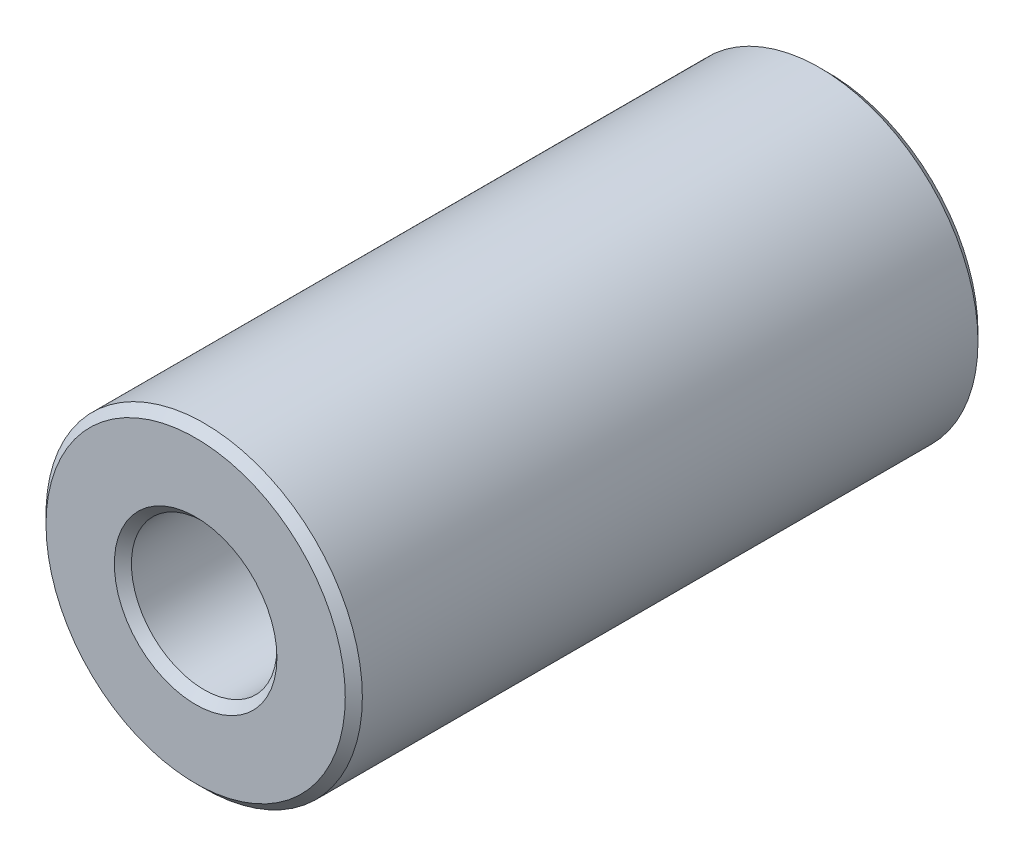
ISO-10303-21;
HEADER;
FILE_DESCRIPTION(('STEP AP214'),'2;1');
FILE_NAME('part.step','',(''),(''),'','','');
FILE_SCHEMA(('AUTOMOTIVE_DESIGN { 1 0 10303 214 1 1 1 1 }'));
ENDSEC;
DATA;
#1=APPLICATION_CONTEXT('core data for automotive mechanical design processes');
#2=APPLICATION_PROTOCOL_DEFINITION('international standard','automotive_design',2000,#1);
#3=PRODUCT_CONTEXT('',#1,'mechanical');
#4=PRODUCT('Part','Part','',(#3));
#5=PRODUCT_RELATED_PRODUCT_CATEGORY('part','',(#4));
#6=PRODUCT_DEFINITION_FORMATION('','',#4);
#7=PRODUCT_DEFINITION_CONTEXT('part definition',#1,'design');
#8=PRODUCT_DEFINITION('design','',#6,#7);
#9=PRODUCT_DEFINITION_SHAPE('','',#8);
#10=(LENGTH_UNIT() NAMED_UNIT(*) SI_UNIT(.MILLI.,.METRE.));
#11=(NAMED_UNIT(*) PLANE_ANGLE_UNIT() SI_UNIT($,.RADIAN.));
#12=(NAMED_UNIT(*) SI_UNIT($,.STERADIAN.) SOLID_ANGLE_UNIT());
#13=UNCERTAINTY_MEASURE_WITH_UNIT(LENGTH_MEASURE(1.E-05),#10,'distance_accuracy_value','');
#14=(GEOMETRIC_REPRESENTATION_CONTEXT(3) GLOBAL_UNCERTAINTY_ASSIGNED_CONTEXT((#13)) GLOBAL_UNIT_ASSIGNED_CONTEXT((#10,
#11,#12)) REPRESENTATION_CONTEXT('',''));
#15=CARTESIAN_POINT('',(0.,0.,0.));
#16=DIRECTION('',(0.,0.,1.));
#17=DIRECTION('',(1.,0.,0.));
#18=AXIS2_PLACEMENT_3D('',#15,#16,#17);
#19=CARTESIAN_POINT('',(0.,0.,-6.35));
#20=DIRECTION('',(0.,0.,1.));
#21=DIRECTION('',(1.,0.,0.));
#22=AXIS2_PLACEMENT_3D('',#19,#20,#21);
#23=CYLINDRICAL_SURFACE('',#22,3.175);
#24=CARTESIAN_POINT('',(0.,0.,6.17855));
#25=DIRECTION('',(0.,0.,1.));
#26=DIRECTION('',(1.,0.,0.));
#27=AXIS2_PLACEMENT_3D('',#24,#25,#26);
#28=CIRCLE('',#27,3.175);
#29=CARTESIAN_POINT('',(3.175,0.,6.17855));
#30=VERTEX_POINT('',#29);
#31=EDGE_CURVE('E65',#30,#30,#28,.F.);
#32=ORIENTED_EDGE('',*,*,#31,.T.);
#33=EDGE_LOOP('',(#32));
#34=FACE_BOUND('',#33,.T.);
#35=CARTESIAN_POINT('',(0.,0.,-6.17855));
#36=DIRECTION('',(0.,0.,1.));
#37=DIRECTION('',(1.,0.,0.));
#38=AXIS2_PLACEMENT_3D('',#35,#36,#37);
#39=CIRCLE('',#38,3.175);
#40=CARTESIAN_POINT('',(3.175,0.,-6.17855));
#41=VERTEX_POINT('',#40);
#42=EDGE_CURVE('E69',#41,#41,#39,.T.);
#43=ORIENTED_EDGE('',*,*,#42,.T.);
#44=EDGE_LOOP('',(#43));
#45=FACE_BOUND('',#44,.T.);
#46=ADVANCED_FACE('F39',(#34,#45),#23,.T.);
#47=CARTESIAN_POINT('',(0.,0.,-6.35));
#48=DIRECTION('',(0.,0.,1.));
#49=DIRECTION('',(1.,0.,0.));
#50=AXIS2_PLACEMENT_3D('',#47,#48,#49);
#51=PLANE('',#50);
#52=CARTESIAN_POINT('',(0.,0.,-6.35));
#53=DIRECTION('',(0.,0.,1.));
#54=DIRECTION('',(1.,0.,0.));
#55=AXIS2_PLACEMENT_3D('',#52,#53,#54);
#56=CIRCLE('',#55,3.00355);
#57=CARTESIAN_POINT('',(3.00355,0.,-6.35));
#58=VERTEX_POINT('',#57);
#59=EDGE_CURVE('E53',#58,#58,#56,.F.);
#60=ORIENTED_EDGE('',*,*,#59,.T.);
#61=EDGE_LOOP('',(#60));
#62=FACE_BOUND('',#61,.T.);
#63=CARTESIAN_POINT('',(0.,0.,-6.35));
#64=DIRECTION('',(0.,0.,1.));
#65=DIRECTION('',(1.,0.,0.));
#66=AXIS2_PLACEMENT_3D('',#63,#64,#65);
#67=CIRCLE('',#66,1.63195);
#68=CARTESIAN_POINT('',(-1.63195,0.,-6.35));
#69=VERTEX_POINT('',#68);
#70=EDGE_CURVE('E59',#69,#69,#67,.T.);
#71=ORIENTED_EDGE('',*,*,#70,.T.);
#72=EDGE_LOOP('',(#71));
#73=FACE_BOUND('',#72,.T.);
#74=ADVANCED_FACE('F98',(#62,#73),#51,.F.);
#75=CARTESIAN_POINT('',(0.,0.,-6.35));
#76=DIRECTION('',(0.,0.,1.));
#77=DIRECTION('',(1.,0.,0.));
#78=AXIS2_PLACEMENT_3D('',#75,#76,#77);
#79=CYLINDRICAL_SURFACE('',#78,1.4605);
#80=CARTESIAN_POINT('',(0.,0.,6.17855));
#81=DIRECTION('',(0.,0.,1.));
#82=DIRECTION('',(1.,0.,0.));
#83=AXIS2_PLACEMENT_3D('',#80,#81,#82);
#84=CIRCLE('',#83,1.4605);
#85=CARTESIAN_POINT('',(1.4605,0.,6.17855));
#86=VERTEX_POINT('',#85);
#87=EDGE_CURVE('E10',#86,#86,#84,.T.);
#88=ORIENTED_EDGE('',*,*,#87,.T.);
#89=EDGE_LOOP('',(#88));
#90=FACE_BOUND('',#89,.T.);
#91=CARTESIAN_POINT('',(0.,0.,-6.17855));
#92=DIRECTION('',(0.,0.,1.));
#93=DIRECTION('',(1.,0.,0.));
#94=AXIS2_PLACEMENT_3D('',#91,#92,#93);
#95=CIRCLE('',#94,1.4605);
#96=CARTESIAN_POINT('',(-1.4605,0.,-6.17855));
#97=VERTEX_POINT('',#96);
#98=EDGE_CURVE('E47',#97,#97,#95,.F.);
#99=ORIENTED_EDGE('',*,*,#98,.T.);
#100=EDGE_LOOP('',(#99));
#101=FACE_BOUND('',#100,.T.);
#102=ADVANCED_FACE('F104',(#90,#101),#79,.F.);
#103=CARTESIAN_POINT('',(0.,0.,6.35));
#104=DIRECTION('',(0.,0.,1.));
#105=DIRECTION('',(1.,0.,0.));
#106=AXIS2_PLACEMENT_3D('',#103,#104,#105);
#107=PLANE('',#106);
#108=CARTESIAN_POINT('',(0.,0.,6.35));
#109=DIRECTION('',(0.,0.,1.));
#110=DIRECTION('',(1.,0.,0.));
#111=AXIS2_PLACEMENT_3D('',#108,#109,#110);
#112=CIRCLE('',#111,3.00355);
#113=CARTESIAN_POINT('',(3.00355,0.,6.35));
#114=VERTEX_POINT('',#113);
#115=EDGE_CURVE('E73',#114,#114,#112,.T.);
#116=ORIENTED_EDGE('',*,*,#115,.T.);
#117=EDGE_LOOP('',(#116));
#118=FACE_BOUND('',#117,.T.);
#119=CARTESIAN_POINT('',(0.,0.,6.35));
#120=DIRECTION('',(0.,0.,1.));
#121=DIRECTION('',(1.,0.,0.));
#122=AXIS2_PLACEMENT_3D('',#119,#120,#121);
#123=CIRCLE('',#122,1.63195000000001);
#124=CARTESIAN_POINT('',(1.63195000000001,0.,6.35));
#125=VERTEX_POINT('',#124);
#126=EDGE_CURVE('E77',#125,#125,#123,.F.);
#127=ORIENTED_EDGE('',*,*,#126,.T.);
#128=EDGE_LOOP('',(#127));
#129=FACE_BOUND('',#128,.T.);
#130=ADVANCED_FACE('F83',(#118,#129),#107,.T.);
#131=CARTESIAN_POINT('',(0.,0.,6.35));
#132=DIRECTION('',(0.,0.,-1.));
#133=DIRECTION('',(-1.,0.,0.));
#134=AXIS2_PLACEMENT_3D('',#131,#132,#133);
#135=CONICAL_SURFACE('',#134,3.00355,0.78539816339745);
#136=ORIENTED_EDGE('',*,*,#31,.F.);
#137=EDGE_LOOP('',(#136));
#138=FACE_BOUND('',#137,.T.);
#139=ORIENTED_EDGE('',*,*,#115,.F.);
#140=EDGE_LOOP('',(#139));
#141=FACE_BOUND('',#140,.T.);
#142=ADVANCED_FACE('F94',(#138,#141),#135,.T.);
#143=CARTESIAN_POINT('',(0.,0.,-6.17855));
#144=DIRECTION('',(0.,0.,1.));
#145=DIRECTION('',(1.,0.,0.));
#146=AXIS2_PLACEMENT_3D('',#143,#144,#145);
#147=CONICAL_SURFACE('',#146,3.175,0.785398163397456);
#148=ORIENTED_EDGE('',*,*,#59,.F.);
#149=EDGE_LOOP('',(#148));
#150=FACE_BOUND('',#149,.T.);
#151=ORIENTED_EDGE('',*,*,#42,.F.);
#152=EDGE_LOOP('',(#151));
#153=FACE_BOUND('',#152,.T.);
#154=ADVANCED_FACE('F88',(#150,#153),#147,.T.);
#155=CARTESIAN_POINT('',(0.,0.,6.17855));
#156=DIRECTION('',(0.,0.,1.));
#157=DIRECTION('',(1.,0.,0.));
#158=AXIS2_PLACEMENT_3D('',#155,#156,#157);
#159=CONICAL_SURFACE('',#158,1.4605,0.785398163397453);
#160=ORIENTED_EDGE('',*,*,#126,.F.);
#161=EDGE_LOOP('',(#160));
#162=FACE_BOUND('',#161,.T.);
#163=ORIENTED_EDGE('',*,*,#87,.F.);
#164=EDGE_LOOP('',(#163));
#165=FACE_BOUND('',#164,.T.);
#166=ADVANCED_FACE('F85',(#162,#165),#159,.F.);
#167=CARTESIAN_POINT('',(0.,0.,-6.35));
#168=DIRECTION('',(0.,0.,-1.));
#169=DIRECTION('',(-1.,0.,0.));
#170=AXIS2_PLACEMENT_3D('',#167,#168,#169);
#171=CONICAL_SURFACE('',#170,1.63195,0.785398163397446);
#172=CARTESIAN_POINT('',(-1.4605,0.,-6.17855));
#173=CARTESIAN_POINT('',(-1.4622859375,0.,-6.1803359375));
#174=CARTESIAN_POINT('',(-1.464071875,0.,-6.182121875));
#175=CARTESIAN_POINT('',(-1.46764375,0.,-6.18569375));
#176=CARTESIAN_POINT('',(-1.4694296875,0.,-6.1874796875));
#177=CARTESIAN_POINT('',(-1.4730015625,0.,-6.1910515625));
#178=CARTESIAN_POINT('',(-1.4747875,0.,-6.1928375));
#179=CARTESIAN_POINT('',(-1.478359375,0.,-6.196409375));
#180=CARTESIAN_POINT('',(-1.4801453125,0.,-6.1981953125));
#181=CARTESIAN_POINT('',(-1.4837171875,0.,-6.2017671875));
#182=CARTESIAN_POINT('',(-1.485503125,0.,-6.203553125));
#183=CARTESIAN_POINT('',(-1.489075,0.,-6.207125));
#184=CARTESIAN_POINT('',(-1.4908609375,0.,-6.2089109375));
#185=CARTESIAN_POINT('',(-1.4944328125,0.,-6.2124828125));
#186=CARTESIAN_POINT('',(-1.49621875,0.,-6.21426875));
#187=CARTESIAN_POINT('',(-1.499790625,0.,-6.217840625));
#188=CARTESIAN_POINT('',(-1.5015765625,0.,-6.2196265625));
#189=CARTESIAN_POINT('',(-1.5051484375,0.,-6.2231984375));
#190=CARTESIAN_POINT('',(-1.506934375,0.,-6.224984375));
#191=CARTESIAN_POINT('',(-1.51050625,0.,-6.22855625));
#192=CARTESIAN_POINT('',(-1.5122921875,0.,-6.2303421875));
#193=CARTESIAN_POINT('',(-1.5158640625,0.,-6.2339140625));
#194=CARTESIAN_POINT('',(-1.51765,0.,-6.2357));
#195=CARTESIAN_POINT('',(-1.521221875,0.,-6.239271875));
#196=CARTESIAN_POINT('',(-1.5230078125,0.,-6.2410578125));
#197=CARTESIAN_POINT('',(-1.5265796875,0.,-6.2446296875));
#198=CARTESIAN_POINT('',(-1.528365625,0.,-6.246415625));
#199=CARTESIAN_POINT('',(-1.5319375,0.,-6.2499875));
#200=CARTESIAN_POINT('',(-1.5337234375,0.,-6.2517734375));
#201=CARTESIAN_POINT('',(-1.5372953125,0.,-6.2553453125));
#202=CARTESIAN_POINT('',(-1.53908125,0.,-6.25713125));
#203=CARTESIAN_POINT('',(-1.542653125,0.,-6.260703125));
#204=CARTESIAN_POINT('',(-1.5444390625,0.,-6.2624890625));
#205=CARTESIAN_POINT('',(-1.5480109375,0.,-6.2660609375));
#206=CARTESIAN_POINT('',(-1.549796875,0.,-6.267846875));
#207=CARTESIAN_POINT('',(-1.55336875,0.,-6.27141875));
#208=CARTESIAN_POINT('',(-1.5551546875,0.,-6.2732046875));
#209=CARTESIAN_POINT('',(-1.5587265625,0.,-6.2767765625));
#210=CARTESIAN_POINT('',(-1.5605125,0.,-6.2785625));
#211=CARTESIAN_POINT('',(-1.564084375,0.,-6.282134375));
#212=CARTESIAN_POINT('',(-1.5658703125,0.,-6.2839203125));
#213=CARTESIAN_POINT('',(-1.5694421875,0.,-6.2874921875));
#214=CARTESIAN_POINT('',(-1.571228125,0.,-6.289278125));
#215=CARTESIAN_POINT('',(-1.5748,0.,-6.29285));
#216=CARTESIAN_POINT('',(-1.5765859375,0.,-6.2946359375));
#217=CARTESIAN_POINT('',(-1.5801578125,0.,-6.2982078125));
#218=CARTESIAN_POINT('',(-1.58194375,0.,-6.29999375));
#219=CARTESIAN_POINT('',(-1.585515625,0.,-6.303565625));
#220=CARTESIAN_POINT('',(-1.5873015625,0.,-6.3053515625));
#221=CARTESIAN_POINT('',(-1.5908734375,0.,-6.3089234375));
#222=CARTESIAN_POINT('',(-1.592659375,0.,-6.310709375));
#223=CARTESIAN_POINT('',(-1.59623125,0.,-6.31428125));
#224=CARTESIAN_POINT('',(-1.5980171875,0.,-6.3160671875));
#225=CARTESIAN_POINT('',(-1.6015890625,0.,-6.3196390625));
#226=CARTESIAN_POINT('',(-1.603375,0.,-6.321425));
#227=CARTESIAN_POINT('',(-1.606946875,0.,-6.324996875));
#228=CARTESIAN_POINT('',(-1.6087328125,0.,-6.3267828125));
#229=CARTESIAN_POINT('',(-1.6123046875,0.,-6.3303546875));
#230=CARTESIAN_POINT('',(-1.614090625,0.,-6.332140625));
#231=CARTESIAN_POINT('',(-1.6176625,0.,-6.3357125));
#232=CARTESIAN_POINT('',(-1.6194484375,0.,-6.3374984375));
#233=CARTESIAN_POINT('',(-1.6230203125,0.,-6.3410703125));
#234=CARTESIAN_POINT('',(-1.62480625,0.,-6.34285625));
#235=CARTESIAN_POINT('',(-1.628378125,0.,-6.346428125));
#236=CARTESIAN_POINT('',(-1.6301640625,0.,-6.3482140625));
#237=CARTESIAN_POINT('',(-1.63195,0.,-6.35));
#238=B_SPLINE_CURVE_WITH_KNOTS('',3,(#172,#173,#174,#175,#176,#177,#178,#179,#180,#181,#182,
#183,#184,#185,#186,#187,#188,#189,#190,#191,#192,#193,#194,#195,#196,#197,#198,#199,#200,#201,
#202,#203,#204,#205,#206,#207,#208,#209,#210,#211,#212,#213,#214,#215,#216,#217,#218,#219,#220,
#221,#222,#223,#224,#225,#226,#227,#228,#229,#230,#231,#232,#233,#234,#235,#236,#237),
.UNSPECIFIED.,.F.,.F.,(4,2,2,2,2,2,2,2,2,2,2,2,2,2,2,2,2,2,2,2,2,2,2,2,2,2,2,2,2,2,2,2,4),(0.,
0.00757709110215241,0.0151541822043042,0.0227312733064568,0.0303083644086086,0.0378854555107604,
0.0454625466129128,0.0530396377150647,0.0606167288172165,0.0681938199193689,0.0757709110215209,
0.0833480021236727,0.0909250932258251,0.0985021843279769,0.106079275430129,0.113656366532281,
0.121233457634433,0.128810548736585,0.136387639838737,0.143964730940889,0.151541822043041,
0.159118913145194,0.166696004247345,0.174273095349497,0.18185018645165,0.189427277553801,
0.197004368655953,0.204581459758106,0.212158550860258,0.219735641962409,0.227312733064562,
0.234889824166714,0.242466915268866),.UNSPECIFIED.);
#239=EDGE_CURVE('BSEAM41',#97,#69,#238,.T.);
#240=ORIENTED_EDGE('',*,*,#98,.F.);
#241=ORIENTED_EDGE('',*,*,#70,.F.);
#242=ORIENTED_EDGE('',*,*,#239,.T.);
#243=ORIENTED_EDGE('',*,*,#239,.F.);
#244=EDGE_LOOP('',(#240,#242,#241,#243));
#245=FACE_BOUND('',#244,.T.);
#246=ADVANCED_FACE('F41',(#245),#171,.F.);
#247=CLOSED_SHELL('',(#46,#74,#102,#130,#142,#154,#166,#246));
#248=MANIFOLD_SOLID_BREP('B2',#247);
#249=ADVANCED_BREP_SHAPE_REPRESENTATION('',(#18,#248),#14);
#250=SHAPE_DEFINITION_REPRESENTATION(#9,#249);
ENDSEC;
END-ISO-10303-21;
